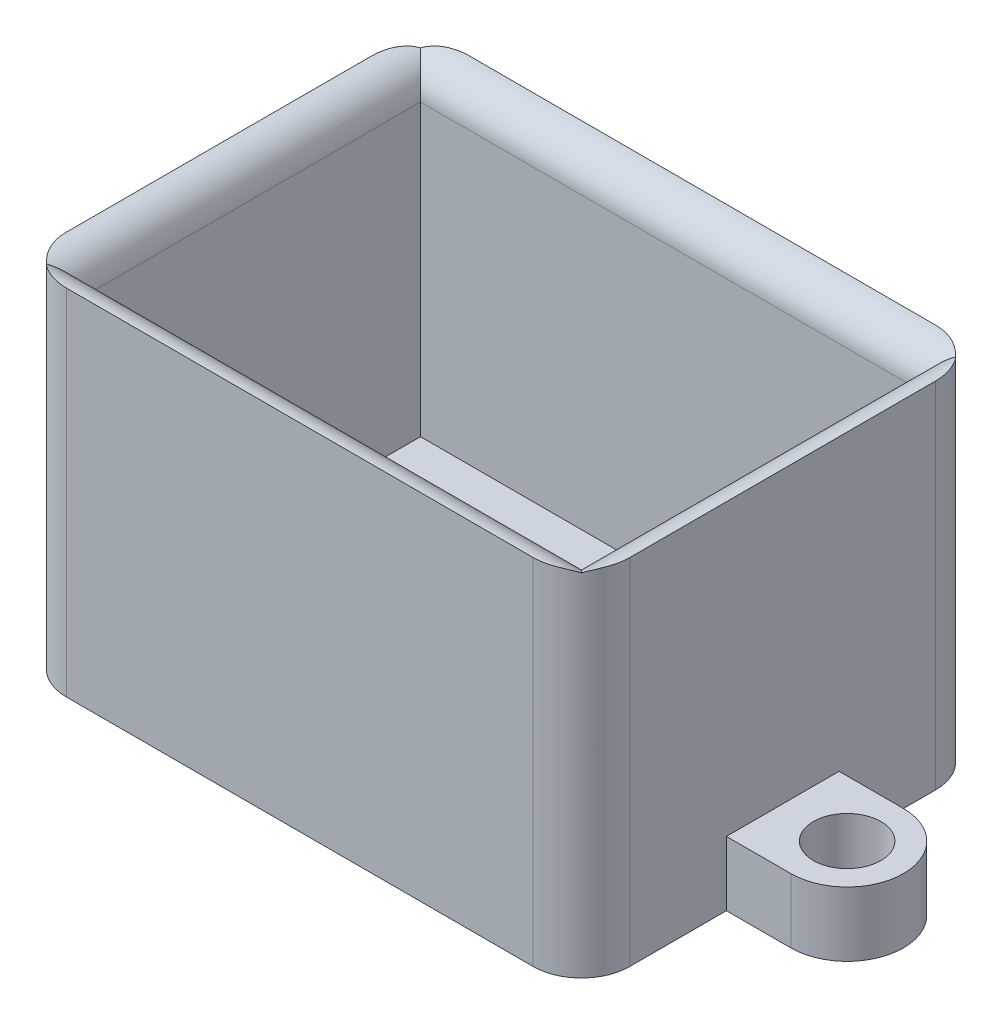
ISO-10303-21;
HEADER;
FILE_DESCRIPTION(('STEP AP214'),'2;1');
FILE_NAME('part.step','',(''),(''),'','','');
FILE_SCHEMA(('AUTOMOTIVE_DESIGN { 1 0 10303 214 1 1 1 1 }'));
ENDSEC;
DATA;
#1=APPLICATION_CONTEXT('core data for automotive mechanical design processes');
#2=APPLICATION_PROTOCOL_DEFINITION('international standard','automotive_design',2000,#1);
#3=PRODUCT_CONTEXT('',#1,'mechanical');
#4=PRODUCT('Part','Part','',(#3));
#5=PRODUCT_RELATED_PRODUCT_CATEGORY('part','',(#4));
#6=PRODUCT_DEFINITION_FORMATION('','',#4);
#7=PRODUCT_DEFINITION_CONTEXT('part definition',#1,'design');
#8=PRODUCT_DEFINITION('design','',#6,#7);
#9=PRODUCT_DEFINITION_SHAPE('','',#8);
#10=(LENGTH_UNIT() NAMED_UNIT(*) SI_UNIT(.MILLI.,.METRE.));
#11=(NAMED_UNIT(*) PLANE_ANGLE_UNIT() SI_UNIT($,.RADIAN.));
#12=(NAMED_UNIT(*) SI_UNIT($,.STERADIAN.) SOLID_ANGLE_UNIT());
#13=UNCERTAINTY_MEASURE_WITH_UNIT(LENGTH_MEASURE(1.E-05),#10,'distance_accuracy_value','');
#14=(GEOMETRIC_REPRESENTATION_CONTEXT(3) GLOBAL_UNCERTAINTY_ASSIGNED_CONTEXT((#13)) GLOBAL_UNIT_ASSIGNED_CONTEXT((#10,
#11,#12)) REPRESENTATION_CONTEXT('',''));
#15=CARTESIAN_POINT('',(0.,0.,0.));
#16=DIRECTION('',(0.,0.,1.));
#17=DIRECTION('',(1.,0.,0.));
#18=AXIS2_PLACEMENT_3D('',#15,#16,#17);
#19=CARTESIAN_POINT('',(17.5,20.,-12.5));
#20=DIRECTION('',(-1.,0.,0.));
#21=DIRECTION('',(0.,0.,1.));
#22=AXIS2_PLACEMENT_3D('',#19,#20,#21);
#23=PLANE('',#22);
#24=DIRECTION('',(0.,0.,1.));
#25=VECTOR('',#24,1.);
#26=CARTESIAN_POINT('',(17.5,-2.,12.5));
#27=LINE('',#26,#25);
#28=CARTESIAN_POINT('',(17.5,-2.,-9.5));
#29=VERTEX_POINT('',#28);
#30=CARTESIAN_POINT('',(17.5,-2.,-3.49999999999999));
#31=VERTEX_POINT('',#30);
#32=EDGE_CURVE('E272',#29,#31,#27,.T.);
#33=ORIENTED_EDGE('',*,*,#32,.F.);
#34=DIRECTION('',(0.,-1.,0.));
#35=VECTOR('',#34,1.);
#36=CARTESIAN_POINT('',(17.5,20.,-9.50000000000001));
#37=LINE('',#36,#35);
#38=CARTESIAN_POINT('',(17.5,20.,-9.50000000000001));
#39=VERTEX_POINT('',#38);
#40=EDGE_CURVE('E326',#29,#39,#37,.F.);
#41=ORIENTED_EDGE('',*,*,#40,.T.);
#42=DIRECTION('',(0.,0.,-1.));
#43=VECTOR('',#42,1.);
#44=CARTESIAN_POINT('',(17.5,20.,-12.5));
#45=LINE('',#44,#43);
#46=CARTESIAN_POINT('',(17.5,20.,9.5));
#47=VERTEX_POINT('',#46);
#48=EDGE_CURVE('E297',#47,#39,#45,.T.);
#49=ORIENTED_EDGE('',*,*,#48,.F.);
#50=DIRECTION('',(0.,-1.,0.));
#51=VECTOR('',#50,1.);
#52=CARTESIAN_POINT('',(17.5,20.,9.5));
#53=LINE('',#52,#51);
#54=CARTESIAN_POINT('',(17.5,-2.,9.5));
#55=VERTEX_POINT('',#54);
#56=EDGE_CURVE('E323',#47,#55,#53,.T.);
#57=ORIENTED_EDGE('',*,*,#56,.T.);
#58=CARTESIAN_POINT('',(17.5,-2.,3.5));
#59=VERTEX_POINT('',#58);
#60=EDGE_CURVE('E271',#59,#55,#27,.T.);
#61=ORIENTED_EDGE('',*,*,#60,.F.);
#62=DIRECTION('',(0.,-1.,0.));
#63=VECTOR('',#62,1.);
#64=CARTESIAN_POINT('',(17.5,2.,3.5));
#65=LINE('',#64,#63);
#66=CARTESIAN_POINT('',(17.5,2.,3.5));
#67=VERTEX_POINT('',#66);
#68=EDGE_CURVE('E196',#67,#59,#65,.T.);
#69=ORIENTED_EDGE('',*,*,#68,.F.);
#70=DIRECTION('',(0.,0.,-1.));
#71=VECTOR('',#70,1.);
#72=CARTESIAN_POINT('',(17.5,2.,3.5));
#73=LINE('',#72,#71);
#74=CARTESIAN_POINT('',(17.5,2.,-3.49999999999999));
#75=VERTEX_POINT('',#74);
#76=EDGE_CURVE('E206',#67,#75,#73,.T.);
#77=ORIENTED_EDGE('',*,*,#76,.T.);
#78=DIRECTION('',(0.,-1.,0.));
#79=VECTOR('',#78,1.);
#80=CARTESIAN_POINT('',(17.5,2.,-3.49999999999999));
#81=LINE('',#80,#79);
#82=EDGE_CURVE('E226',#75,#31,#81,.T.);
#83=ORIENTED_EDGE('',*,*,#82,.T.);
#84=EDGE_LOOP('',(#33,#41,#49,#57,#61,#69,#77,#83));
#85=FACE_BOUND('',#84,.T.);
#86=ADVANCED_FACE('F32',(#85),#23,.F.);
#87=CARTESIAN_POINT('',(-17.5,20.,-12.5));
#88=DIRECTION('',(1.,0.,0.));
#89=DIRECTION('',(0.,0.,-1.));
#90=AXIS2_PLACEMENT_3D('',#87,#88,#89);
#91=PLANE('',#90);
#92=DIRECTION('',(0.,0.,1.));
#93=VECTOR('',#92,1.);
#94=CARTESIAN_POINT('',(-17.5,20.,-12.5));
#95=LINE('',#94,#93);
#96=CARTESIAN_POINT('',(-17.5,20.,-9.50000000000001));
#97=VERTEX_POINT('',#96);
#98=CARTESIAN_POINT('',(-17.5,20.,9.5));
#99=VERTEX_POINT('',#98);
#100=EDGE_CURVE('E303',#97,#99,#95,.T.);
#101=ORIENTED_EDGE('',*,*,#100,.F.);
#102=DIRECTION('',(0.,-1.,0.));
#103=VECTOR('',#102,1.);
#104=CARTESIAN_POINT('',(-17.5,20.,-9.50000000000001));
#105=LINE('',#104,#103);
#106=CARTESIAN_POINT('',(-17.5,-2.,-9.5));
#107=VERTEX_POINT('',#106);
#108=EDGE_CURVE('E332',#97,#107,#105,.T.);
#109=ORIENTED_EDGE('',*,*,#108,.T.);
#110=DIRECTION('',(0.,0.,-1.));
#111=VECTOR('',#110,1.);
#112=CARTESIAN_POINT('',(-17.5,-2.,12.5));
#113=LINE('',#112,#111);
#114=CARTESIAN_POINT('',(-17.5,-2.,-3.5));
#115=VERTEX_POINT('',#114);
#116=EDGE_CURVE('E259',#115,#107,#113,.T.);
#117=ORIENTED_EDGE('',*,*,#116,.F.);
#118=DIRECTION('',(0.,-1.,0.));
#119=VECTOR('',#118,1.);
#120=CARTESIAN_POINT('',(-17.5,2.,-3.5));
#121=LINE('',#120,#119);
#122=CARTESIAN_POINT('',(-17.5,2.,-3.5));
#123=VERTEX_POINT('',#122);
#124=EDGE_CURVE('E263',#123,#115,#121,.T.);
#125=ORIENTED_EDGE('',*,*,#124,.F.);
#126=DIRECTION('',(0.,0.,1.));
#127=VECTOR('',#126,1.);
#128=CARTESIAN_POINT('',(-17.5,2.,3.49999999999999));
#129=LINE('',#128,#127);
#130=CARTESIAN_POINT('',(-17.5,2.,3.49999999999999));
#131=VERTEX_POINT('',#130);
#132=EDGE_CURVE('E243',#123,#131,#129,.T.);
#133=ORIENTED_EDGE('',*,*,#132,.T.);
#134=DIRECTION('',(0.,-1.,0.));
#135=VECTOR('',#134,1.);
#136=CARTESIAN_POINT('',(-17.5,2.,3.49999999999999));
#137=LINE('',#136,#135);
#138=CARTESIAN_POINT('',(-17.5,-2.,3.49999999999999));
#139=VERTEX_POINT('',#138);
#140=EDGE_CURVE('E260',#131,#139,#137,.T.);
#141=ORIENTED_EDGE('',*,*,#140,.T.);
#142=CARTESIAN_POINT('',(-17.5,-2.,9.5));
#143=VERTEX_POINT('',#142);
#144=EDGE_CURVE('E266',#143,#139,#113,.T.);
#145=ORIENTED_EDGE('',*,*,#144,.F.);
#146=DIRECTION('',(0.,-1.,0.));
#147=VECTOR('',#146,1.);
#148=CARTESIAN_POINT('',(-17.5,20.,9.5));
#149=LINE('',#148,#147);
#150=EDGE_CURVE('E329',#143,#99,#149,.F.);
#151=ORIENTED_EDGE('',*,*,#150,.T.);
#152=EDGE_LOOP('',(#101,#109,#117,#125,#133,#141,#145,#151));
#153=FACE_BOUND('',#152,.T.);
#154=ADVANCED_FACE('F500',(#153),#91,.F.);
#155=CARTESIAN_POINT('',(-17.5,20.,-12.5));
#156=DIRECTION('',(0.,0.,1.));
#157=DIRECTION('',(1.,0.,0.));
#158=AXIS2_PLACEMENT_3D('',#155,#156,#157);
#159=PLANE('',#158);
#160=DIRECTION('',(-1.,0.,0.));
#161=VECTOR('',#160,1.);
#162=CARTESIAN_POINT('',(-17.5,20.,-12.5));
#163=LINE('',#162,#161);
#164=CARTESIAN_POINT('',(14.5,20.,-12.5));
#165=VERTEX_POINT('',#164);
#166=CARTESIAN_POINT('',(-14.5,20.,-12.5));
#167=VERTEX_POINT('',#166);
#168=EDGE_CURVE('E300',#165,#167,#163,.T.);
#169=ORIENTED_EDGE('',*,*,#168,.F.);
#170=DIRECTION('',(0.,-1.,0.));
#171=VECTOR('',#170,1.);
#172=CARTESIAN_POINT('',(14.5,20.,-12.5));
#173=LINE('',#172,#171);
#174=CARTESIAN_POINT('',(14.5,-2.,-12.5));
#175=VERTEX_POINT('',#174);
#176=EDGE_CURVE('E312',#165,#175,#173,.T.);
#177=ORIENTED_EDGE('',*,*,#176,.T.);
#178=DIRECTION('',(1.,0.,0.));
#179=VECTOR('',#178,1.);
#180=CARTESIAN_POINT('',(-17.5,-2.,-12.5));
#181=LINE('',#180,#179);
#182=CARTESIAN_POINT('',(-14.5,-2.,-12.5));
#183=VERTEX_POINT('',#182);
#184=EDGE_CURVE('E268',#183,#175,#181,.T.);
#185=ORIENTED_EDGE('',*,*,#184,.F.);
#186=DIRECTION('',(0.,-1.,0.));
#187=VECTOR('',#186,1.);
#188=CARTESIAN_POINT('',(-14.5,20.,-12.5));
#189=LINE('',#188,#187);
#190=EDGE_CURVE('E309',#183,#167,#189,.F.);
#191=ORIENTED_EDGE('',*,*,#190,.T.);
#192=EDGE_LOOP('',(#169,#177,#185,#191));
#193=FACE_BOUND('',#192,.T.);
#194=ADVANCED_FACE('F430',(#193),#159,.F.);
#195=CARTESIAN_POINT('',(-17.5,20.,12.5));
#196=DIRECTION('',(0.,0.,-1.));
#197=DIRECTION('',(-1.,0.,0.));
#198=AXIS2_PLACEMENT_3D('',#195,#196,#197);
#199=PLANE('',#198);
#200=DIRECTION('',(-1.,0.,0.));
#201=VECTOR('',#200,1.);
#202=CARTESIAN_POINT('',(-17.5,-2.,12.5));
#203=LINE('',#202,#201);
#204=CARTESIAN_POINT('',(14.5,-2.,12.5));
#205=VERTEX_POINT('',#204);
#206=CARTESIAN_POINT('',(-14.5,-2.,12.5));
#207=VERTEX_POINT('',#206);
#208=EDGE_CURVE('E274',#205,#207,#203,.T.);
#209=ORIENTED_EDGE('',*,*,#208,.F.);
#210=DIRECTION('',(0.,-1.,0.));
#211=VECTOR('',#210,1.);
#212=CARTESIAN_POINT('',(14.5,20.,12.5));
#213=LINE('',#212,#211);
#214=CARTESIAN_POINT('',(14.5,20.,12.5));
#215=VERTEX_POINT('',#214);
#216=EDGE_CURVE('E338',#205,#215,#213,.F.);
#217=ORIENTED_EDGE('',*,*,#216,.T.);
#218=DIRECTION('',(1.,0.,0.));
#219=VECTOR('',#218,1.);
#220=CARTESIAN_POINT('',(-17.5,20.,12.5));
#221=LINE('',#220,#219);
#222=CARTESIAN_POINT('',(-14.5,20.,12.5));
#223=VERTEX_POINT('',#222);
#224=EDGE_CURVE('E306',#223,#215,#221,.T.);
#225=ORIENTED_EDGE('',*,*,#224,.F.);
#226=DIRECTION('',(0.,-1.,0.));
#227=VECTOR('',#226,1.);
#228=CARTESIAN_POINT('',(-14.5,20.,12.5));
#229=LINE('',#228,#227);
#230=EDGE_CURVE('E335',#223,#207,#229,.T.);
#231=ORIENTED_EDGE('',*,*,#230,.T.);
#232=EDGE_LOOP('',(#209,#217,#225,#231));
#233=FACE_BOUND('',#232,.T.);
#234=ADVANCED_FACE('F450',(#233),#199,.F.);
#235=CARTESIAN_POINT('',(15.5,20.,-10.5));
#236=DIRECTION('',(-1.,0.,0.));
#237=DIRECTION('',(0.,0.,1.));
#238=AXIS2_PLACEMENT_3D('',#235,#236,#237);
#239=PLANE('',#238);
#240=DIRECTION('',(0.,-1.,0.));
#241=VECTOR('',#240,1.);
#242=CARTESIAN_POINT('',(15.5,20.,10.5));
#243=LINE('',#242,#241);
#244=CARTESIAN_POINT('',(15.5,18.,10.5));
#245=VERTEX_POINT('',#244);
#246=CARTESIAN_POINT('',(15.5,0.,10.5));
#247=VERTEX_POINT('',#246);
#248=EDGE_CURVE('E289',#245,#247,#243,.T.);
#249=ORIENTED_EDGE('',*,*,#248,.F.);
#250=DIRECTION('',(0.,0.,-1.));
#251=VECTOR('',#250,1.);
#252=CARTESIAN_POINT('',(15.5,18.,-10.5));
#253=LINE('',#252,#251);
#254=CARTESIAN_POINT('',(15.5,18.,-10.5));
#255=VERTEX_POINT('',#254);
#256=EDGE_CURVE('E341',#245,#255,#253,.T.);
#257=ORIENTED_EDGE('',*,*,#256,.T.);
#258=DIRECTION('',(0.,-1.,0.));
#259=VECTOR('',#258,1.);
#260=CARTESIAN_POINT('',(15.5,20.,-10.5));
#261=LINE('',#260,#259);
#262=CARTESIAN_POINT('',(15.5,0.,-10.5));
#263=VERTEX_POINT('',#262);
#264=EDGE_CURVE('E295',#255,#263,#261,.T.);
#265=ORIENTED_EDGE('',*,*,#264,.T.);
#266=DIRECTION('',(0.,0.,-1.));
#267=VECTOR('',#266,1.);
#268=CARTESIAN_POINT('',(15.5,0.,-10.5));
#269=LINE('',#268,#267);
#270=EDGE_CURVE('E277',#247,#263,#269,.T.);
#271=ORIENTED_EDGE('',*,*,#270,.F.);
#272=EDGE_LOOP('',(#249,#257,#265,#271));
#273=FACE_BOUND('',#272,.T.);
#274=ADVANCED_FACE('F474',(#273),#239,.T.);
#275=CARTESIAN_POINT('',(-15.5,20.,-10.5));
#276=DIRECTION('',(0.,0.,1.));
#277=DIRECTION('',(1.,0.,0.));
#278=AXIS2_PLACEMENT_3D('',#275,#276,#277);
#279=PLANE('',#278);
#280=ORIENTED_EDGE('',*,*,#264,.F.);
#281=DIRECTION('',(-1.,0.,0.));
#282=VECTOR('',#281,1.);
#283=CARTESIAN_POINT('',(-15.5,18.,-10.5));
#284=LINE('',#283,#282);
#285=CARTESIAN_POINT('',(-15.5,18.,-10.5));
#286=VERTEX_POINT('',#285);
#287=EDGE_CURVE('E412',#255,#286,#284,.T.);
#288=ORIENTED_EDGE('',*,*,#287,.T.);
#289=DIRECTION('',(0.,-1.,0.));
#290=VECTOR('',#289,1.);
#291=CARTESIAN_POINT('',(-15.5,20.,-10.5));
#292=LINE('',#291,#290);
#293=CARTESIAN_POINT('',(-15.5,0.,-10.5));
#294=VERTEX_POINT('',#293);
#295=EDGE_CURVE('E293',#286,#294,#292,.T.);
#296=ORIENTED_EDGE('',*,*,#295,.T.);
#297=DIRECTION('',(-1.,0.,0.));
#298=VECTOR('',#297,1.);
#299=CARTESIAN_POINT('',(-15.5,0.,-10.5));
#300=LINE('',#299,#298);
#301=EDGE_CURVE('E280',#263,#294,#300,.T.);
#302=ORIENTED_EDGE('',*,*,#301,.F.);
#303=EDGE_LOOP('',(#280,#288,#296,#302));
#304=FACE_BOUND('',#303,.T.);
#305=ADVANCED_FACE('F477',(#304),#279,.T.);
#306=CARTESIAN_POINT('',(-15.5,20.,-10.5));
#307=DIRECTION('',(1.,0.,0.));
#308=DIRECTION('',(0.,0.,-1.));
#309=AXIS2_PLACEMENT_3D('',#306,#307,#308);
#310=PLANE('',#309);
#311=ORIENTED_EDGE('',*,*,#295,.F.);
#312=DIRECTION('',(0.,0.,1.));
#313=VECTOR('',#312,1.);
#314=CARTESIAN_POINT('',(-15.5,18.,-10.5));
#315=LINE('',#314,#313);
#316=CARTESIAN_POINT('',(-15.5,18.,10.5));
#317=VERTEX_POINT('',#316);
#318=EDGE_CURVE('E58',#286,#317,#315,.T.);
#319=ORIENTED_EDGE('',*,*,#318,.T.);
#320=DIRECTION('',(0.,-1.,0.));
#321=VECTOR('',#320,1.);
#322=CARTESIAN_POINT('',(-15.5,20.,10.5));
#323=LINE('',#322,#321);
#324=CARTESIAN_POINT('',(-15.5,0.,10.5));
#325=VERTEX_POINT('',#324);
#326=EDGE_CURVE('E291',#317,#325,#323,.T.);
#327=ORIENTED_EDGE('',*,*,#326,.T.);
#328=DIRECTION('',(0.,0.,1.));
#329=VECTOR('',#328,1.);
#330=CARTESIAN_POINT('',(-15.5,0.,-10.5));
#331=LINE('',#330,#329);
#332=EDGE_CURVE('E283',#294,#325,#331,.T.);
#333=ORIENTED_EDGE('',*,*,#332,.F.);
#334=EDGE_LOOP('',(#311,#319,#327,#333));
#335=FACE_BOUND('',#334,.T.);
#336=ADVANCED_FACE('F515',(#335),#310,.T.);
#337=CARTESIAN_POINT('',(-15.5,20.,10.5));
#338=DIRECTION('',(0.,0.,-1.));
#339=DIRECTION('',(-1.,0.,0.));
#340=AXIS2_PLACEMENT_3D('',#337,#338,#339);
#341=PLANE('',#340);
#342=ORIENTED_EDGE('',*,*,#326,.F.);
#343=DIRECTION('',(1.,0.,0.));
#344=VECTOR('',#343,1.);
#345=CARTESIAN_POINT('',(-15.5,18.,10.5));
#346=LINE('',#345,#344);
#347=EDGE_CURVE('E11',#317,#245,#346,.T.);
#348=ORIENTED_EDGE('',*,*,#347,.T.);
#349=ORIENTED_EDGE('',*,*,#248,.T.);
#350=DIRECTION('',(1.,0.,0.));
#351=VECTOR('',#350,1.);
#352=CARTESIAN_POINT('',(-15.5,0.,10.5));
#353=LINE('',#352,#351);
#354=EDGE_CURVE('E286',#325,#247,#353,.T.);
#355=ORIENTED_EDGE('',*,*,#354,.F.);
#356=EDGE_LOOP('',(#342,#348,#349,#355));
#357=FACE_BOUND('',#356,.T.);
#358=ADVANCED_FACE('F483',(#357),#341,.T.);
#359=CARTESIAN_POINT('',(0.,0.,0.));
#360=DIRECTION('',(0.,-1.,0.));
#361=DIRECTION('',(0.,0.,-1.));
#362=AXIS2_PLACEMENT_3D('',#359,#360,#361);
#363=PLANE('',#362);
#364=ORIENTED_EDGE('',*,*,#354,.T.);
#365=ORIENTED_EDGE('',*,*,#270,.T.);
#366=ORIENTED_EDGE('',*,*,#301,.T.);
#367=ORIENTED_EDGE('',*,*,#332,.T.);
#368=EDGE_LOOP('',(#364,#365,#366,#367));
#369=FACE_BOUND('',#368,.T.);
#370=ADVANCED_FACE('F480',(#369),#363,.F.);
#371=CARTESIAN_POINT('',(0.,-2.,0.));
#372=DIRECTION('',(0.,-1.,0.));
#373=DIRECTION('',(0.,0.,-1.));
#374=AXIS2_PLACEMENT_3D('',#371,#372,#373);
#375=PLANE('',#374);
#376=ORIENTED_EDGE('',*,*,#184,.T.);
#377=CARTESIAN_POINT('',(14.5,-2.,-9.50000000000001));
#378=DIRECTION('',(0.,-1.,0.));
#379=DIRECTION('',(0.,0.,-1.));
#380=AXIS2_PLACEMENT_3D('',#377,#378,#379);
#381=CIRCLE('',#380,3.);
#382=EDGE_CURVE('E321',#175,#29,#381,.T.);
#383=ORIENTED_EDGE('',*,*,#382,.T.);
#384=ORIENTED_EDGE('',*,*,#32,.T.);
#385=DIRECTION('',(1.,0.,0.));
#386=VECTOR('',#385,1.);
#387=CARTESIAN_POINT('',(21.5,-2.,-3.5));
#388=LINE('',#387,#386);
#389=CARTESIAN_POINT('',(21.5,-2.,-3.5));
#390=VERTEX_POINT('',#389);
#391=EDGE_CURVE('E210',#31,#390,#388,.T.);
#392=ORIENTED_EDGE('',*,*,#391,.T.);
#393=CARTESIAN_POINT('',(21.5,-2.,0.));
#394=DIRECTION('',(0.,-1.,0.));
#395=DIRECTION('',(0.,0.,1.));
#396=AXIS2_PLACEMENT_3D('',#393,#394,#395);
#397=CIRCLE('',#396,3.5);
#398=CARTESIAN_POINT('',(21.5,-2.,3.5));
#399=VERTEX_POINT('',#398);
#400=EDGE_CURVE('E220',#390,#399,#397,.T.);
#401=ORIENTED_EDGE('',*,*,#400,.T.);
#402=DIRECTION('',(-1.,0.,0.));
#403=VECTOR('',#402,1.);
#404=CARTESIAN_POINT('',(21.5,-2.,3.5));
#405=LINE('',#404,#403);
#406=EDGE_CURVE('E191',#399,#59,#405,.T.);
#407=ORIENTED_EDGE('',*,*,#406,.T.);
#408=ORIENTED_EDGE('',*,*,#60,.T.);
#409=CARTESIAN_POINT('',(14.5,-2.,9.5));
#410=DIRECTION('',(0.,-1.,0.));
#411=DIRECTION('',(0.,0.,-1.));
#412=AXIS2_PLACEMENT_3D('',#409,#410,#411);
#413=CIRCLE('',#412,3.);
#414=EDGE_CURVE('E317',#55,#205,#413,.T.);
#415=ORIENTED_EDGE('',*,*,#414,.T.);
#416=ORIENTED_EDGE('',*,*,#208,.T.);
#417=CARTESIAN_POINT('',(-14.5,-2.,9.5));
#418=DIRECTION('',(0.,-1.,0.));
#419=DIRECTION('',(0.,0.,-1.));
#420=AXIS2_PLACEMENT_3D('',#417,#418,#419);
#421=CIRCLE('',#420,3.);
#422=EDGE_CURVE('E315',#207,#143,#421,.T.);
#423=ORIENTED_EDGE('',*,*,#422,.T.);
#424=ORIENTED_EDGE('',*,*,#144,.T.);
#425=DIRECTION('',(-1.,0.,0.));
#426=VECTOR('',#425,1.);
#427=CARTESIAN_POINT('',(-21.5,-2.,3.5));
#428=LINE('',#427,#426);
#429=CARTESIAN_POINT('',(-21.5,-2.,3.5));
#430=VERTEX_POINT('',#429);
#431=EDGE_CURVE('E240',#139,#430,#428,.T.);
#432=ORIENTED_EDGE('',*,*,#431,.T.);
#433=CARTESIAN_POINT('',(-21.5,-2.,0.));
#434=DIRECTION('',(0.,-1.,0.));
#435=DIRECTION('',(0.,0.,-1.));
#436=AXIS2_PLACEMENT_3D('',#433,#434,#435);
#437=CIRCLE('',#436,3.5);
#438=CARTESIAN_POINT('',(-21.5,-2.,-3.5));
#439=VERTEX_POINT('',#438);
#440=EDGE_CURVE('E233',#430,#439,#437,.T.);
#441=ORIENTED_EDGE('',*,*,#440,.T.);
#442=DIRECTION('',(1.,0.,0.));
#443=VECTOR('',#442,1.);
#444=CARTESIAN_POINT('',(-21.5,-2.,-3.5));
#445=LINE('',#444,#443);
#446=EDGE_CURVE('E252',#439,#115,#445,.T.);
#447=ORIENTED_EDGE('',*,*,#446,.T.);
#448=ORIENTED_EDGE('',*,*,#116,.T.);
#449=CARTESIAN_POINT('',(-14.5,-2.,-9.50000000000001));
#450=DIRECTION('',(0.,-1.,0.));
#451=DIRECTION('',(0.,0.,-1.));
#452=AXIS2_PLACEMENT_3D('',#449,#450,#451);
#453=CIRCLE('',#452,3.);
#454=EDGE_CURVE('E319',#107,#183,#453,.T.);
#455=ORIENTED_EDGE('',*,*,#454,.T.);
#456=EDGE_LOOP('',(#376,#383,#384,#392,#401,#407,#408,#415,#416,#423,#424,#432,#441,#447,#448,#455));
#457=FACE_BOUND('',#456,.T.);
#458=CARTESIAN_POINT('',(-21.5,-2.,0.));
#459=DIRECTION('',(0.,-1.,0.));
#460=DIRECTION('',(0.,0.,-1.));
#461=AXIS2_PLACEMENT_3D('',#458,#459,#460);
#462=CIRCLE('',#461,2.1);
#463=CARTESIAN_POINT('',(-21.5,-2.,-2.1));
#464=VERTEX_POINT('',#463);
#465=EDGE_CURVE('E225',#464,#464,#462,.T.);
#466=ORIENTED_EDGE('',*,*,#465,.F.);
#467=EDGE_LOOP('',(#466));
#468=FACE_BOUND('',#467,.T.);
#469=CARTESIAN_POINT('',(21.5,-2.,0.));
#470=DIRECTION('',(0.,-1.,0.));
#471=DIRECTION('',(0.,0.,1.));
#472=AXIS2_PLACEMENT_3D('',#469,#470,#471);
#473=CIRCLE('',#472,2.1);
#474=CARTESIAN_POINT('',(21.5,-2.,2.1));
#475=VERTEX_POINT('',#474);
#476=EDGE_CURVE('E215',#475,#475,#473,.T.);
#477=ORIENTED_EDGE('',*,*,#476,.F.);
#478=EDGE_LOOP('',(#477));
#479=FACE_BOUND('',#478,.T.);
#480=ADVANCED_FACE('F436',(#457,#468,#479),#375,.T.);
#481=CARTESIAN_POINT('',(-21.5,2.,0.));
#482=DIRECTION('',(0.,-1.,0.));
#483=DIRECTION('',(0.,0.,-1.));
#484=AXIS2_PLACEMENT_3D('',#481,#482,#483);
#485=CYLINDRICAL_SURFACE('',#484,3.5);
#486=ORIENTED_EDGE('',*,*,#440,.F.);
#487=DIRECTION('',(0.,-1.,0.));
#488=VECTOR('',#487,1.);
#489=CARTESIAN_POINT('',(-21.5,2.,3.5));
#490=LINE('',#489,#488);
#491=CARTESIAN_POINT('',(-21.5,2.,3.5));
#492=VERTEX_POINT('',#491);
#493=EDGE_CURVE('E257',#492,#430,#490,.T.);
#494=ORIENTED_EDGE('',*,*,#493,.F.);
#495=CARTESIAN_POINT('',(-21.5,2.,0.));
#496=DIRECTION('',(0.,-1.,0.));
#497=DIRECTION('',(0.,0.,-1.));
#498=AXIS2_PLACEMENT_3D('',#495,#496,#497);
#499=CIRCLE('',#498,3.5);
#500=CARTESIAN_POINT('',(-21.5,2.,-3.5));
#501=VERTEX_POINT('',#500);
#502=EDGE_CURVE('E236',#492,#501,#499,.T.);
#503=ORIENTED_EDGE('',*,*,#502,.T.);
#504=DIRECTION('',(0.,-1.,0.));
#505=VECTOR('',#504,1.);
#506=CARTESIAN_POINT('',(-21.5,2.,-3.5));
#507=LINE('',#506,#505);
#508=EDGE_CURVE('E249',#501,#439,#507,.T.);
#509=ORIENTED_EDGE('',*,*,#508,.T.);
#510=EDGE_LOOP('',(#486,#494,#503,#509));
#511=FACE_BOUND('',#510,.T.);
#512=ADVANCED_FACE('F524',(#511),#485,.T.);
#513=CARTESIAN_POINT('',(-21.5,2.,3.5));
#514=DIRECTION('',(0.,0.,1.));
#515=DIRECTION('',(1.,0.,0.));
#516=AXIS2_PLACEMENT_3D('',#513,#514,#515);
#517=PLANE('',#516);
#518=ORIENTED_EDGE('',*,*,#431,.F.);
#519=ORIENTED_EDGE('',*,*,#140,.F.);
#520=DIRECTION('',(-1.,0.,0.));
#521=VECTOR('',#520,1.);
#522=CARTESIAN_POINT('',(-21.5,2.,3.5));
#523=LINE('',#522,#521);
#524=EDGE_CURVE('E246',#131,#492,#523,.T.);
#525=ORIENTED_EDGE('',*,*,#524,.T.);
#526=ORIENTED_EDGE('',*,*,#493,.T.);
#527=EDGE_LOOP('',(#518,#519,#525,#526));
#528=FACE_BOUND('',#527,.T.);
#529=ADVANCED_FACE('F527',(#528),#517,.T.);
#530=CARTESIAN_POINT('',(-21.5,2.,-3.5));
#531=DIRECTION('',(0.,0.,-1.));
#532=DIRECTION('',(-1.,0.,0.));
#533=AXIS2_PLACEMENT_3D('',#530,#531,#532);
#534=PLANE('',#533);
#535=ORIENTED_EDGE('',*,*,#446,.F.);
#536=ORIENTED_EDGE('',*,*,#508,.F.);
#537=DIRECTION('',(1.,0.,0.));
#538=VECTOR('',#537,1.);
#539=CARTESIAN_POINT('',(-21.5,2.,-3.5));
#540=LINE('',#539,#538);
#541=EDGE_CURVE('E239',#501,#123,#540,.T.);
#542=ORIENTED_EDGE('',*,*,#541,.T.);
#543=ORIENTED_EDGE('',*,*,#124,.T.);
#544=EDGE_LOOP('',(#535,#536,#542,#543));
#545=FACE_BOUND('',#544,.T.);
#546=ADVANCED_FACE('F529',(#545),#534,.T.);
#547=CARTESIAN_POINT('',(-21.5,2.,0.));
#548=DIRECTION('',(0.,-1.,0.));
#549=DIRECTION('',(0.,0.,-1.));
#550=AXIS2_PLACEMENT_3D('',#547,#548,#549);
#551=PLANE('',#550);
#552=CARTESIAN_POINT('',(-21.5,2.,0.));
#553=DIRECTION('',(0.,-1.,0.));
#554=DIRECTION('',(0.,0.,-1.));
#555=AXIS2_PLACEMENT_3D('',#552,#553,#554);
#556=CIRCLE('',#555,2.1);
#557=CARTESIAN_POINT('',(-21.5,2.,-2.1));
#558=VERTEX_POINT('',#557);
#559=EDGE_CURVE('E230',#558,#558,#556,.T.);
#560=ORIENTED_EDGE('',*,*,#559,.T.);
#561=EDGE_LOOP('',(#560));
#562=FACE_BOUND('',#561,.T.);
#563=ORIENTED_EDGE('',*,*,#502,.F.);
#564=ORIENTED_EDGE('',*,*,#524,.F.);
#565=ORIENTED_EDGE('',*,*,#132,.F.);
#566=ORIENTED_EDGE('',*,*,#541,.F.);
#567=EDGE_LOOP('',(#563,#564,#565,#566));
#568=FACE_BOUND('',#567,.T.);
#569=ADVANCED_FACE('F532',(#562,#568),#551,.F.);
#570=CARTESIAN_POINT('',(-21.5,2.,0.));
#571=DIRECTION('',(0.,-1.,0.));
#572=DIRECTION('',(0.,0.,-1.));
#573=AXIS2_PLACEMENT_3D('',#570,#571,#572);
#574=CYLINDRICAL_SURFACE('',#573,2.1);
#575=ORIENTED_EDGE('',*,*,#559,.F.);
#576=EDGE_LOOP('',(#575));
#577=FACE_BOUND('',#576,.T.);
#578=ORIENTED_EDGE('',*,*,#465,.T.);
#579=EDGE_LOOP('',(#578));
#580=FACE_BOUND('',#579,.T.);
#581=ADVANCED_FACE('F539',(#577,#580),#574,.F.);
#582=CARTESIAN_POINT('',(21.5,2.,0.));
#583=DIRECTION('',(0.,-1.,0.));
#584=DIRECTION('',(0.,0.,-1.));
#585=AXIS2_PLACEMENT_3D('',#582,#583,#584);
#586=CYLINDRICAL_SURFACE('',#585,3.5);
#587=ORIENTED_EDGE('',*,*,#400,.F.);
#588=DIRECTION('',(0.,-1.,0.));
#589=VECTOR('',#588,1.);
#590=CARTESIAN_POINT('',(21.5,2.,-3.5));
#591=LINE('',#590,#589);
#592=CARTESIAN_POINT('',(21.5,2.,-3.5));
#593=VERTEX_POINT('',#592);
#594=EDGE_CURVE('E209',#593,#390,#591,.T.);
#595=ORIENTED_EDGE('',*,*,#594,.F.);
#596=CARTESIAN_POINT('',(21.5,2.,0.));
#597=DIRECTION('',(0.,-1.,0.));
#598=DIRECTION('',(0.,0.,1.));
#599=AXIS2_PLACEMENT_3D('',#596,#597,#598);
#600=CIRCLE('',#599,3.5);
#601=CARTESIAN_POINT('',(21.5,2.,3.5));
#602=VERTEX_POINT('',#601);
#603=EDGE_CURVE('E203',#593,#602,#600,.T.);
#604=ORIENTED_EDGE('',*,*,#603,.T.);
#605=DIRECTION('',(0.,-1.,0.));
#606=VECTOR('',#605,1.);
#607=CARTESIAN_POINT('',(21.5,2.,3.5));
#608=LINE('',#607,#606);
#609=EDGE_CURVE('E185',#602,#399,#608,.T.);
#610=ORIENTED_EDGE('',*,*,#609,.T.);
#611=EDGE_LOOP('',(#587,#595,#604,#610));
#612=FACE_BOUND('',#611,.T.);
#613=ADVANCED_FACE('F208',(#612),#586,.T.);
#614=CARTESIAN_POINT('',(21.5,2.,-3.5));
#615=DIRECTION('',(0.,0.,-1.));
#616=DIRECTION('',(-1.,0.,0.));
#617=AXIS2_PLACEMENT_3D('',#614,#615,#616);
#618=PLANE('',#617);
#619=ORIENTED_EDGE('',*,*,#391,.F.);
#620=ORIENTED_EDGE('',*,*,#82,.F.);
#621=DIRECTION('',(1.,0.,0.));
#622=VECTOR('',#621,1.);
#623=CARTESIAN_POINT('',(21.5,2.,-3.5));
#624=LINE('',#623,#622);
#625=EDGE_CURVE('E197',#75,#593,#624,.T.);
#626=ORIENTED_EDGE('',*,*,#625,.T.);
#627=ORIENTED_EDGE('',*,*,#594,.T.);
#628=EDGE_LOOP('',(#619,#620,#626,#627));
#629=FACE_BOUND('',#628,.T.);
#630=ADVANCED_FACE('F442',(#629),#618,.T.);
#631=CARTESIAN_POINT('',(21.5,2.,3.5));
#632=DIRECTION('',(0.,0.,1.));
#633=DIRECTION('',(1.,0.,0.));
#634=AXIS2_PLACEMENT_3D('',#631,#632,#633);
#635=PLANE('',#634);
#636=ORIENTED_EDGE('',*,*,#406,.F.);
#637=ORIENTED_EDGE('',*,*,#609,.F.);
#638=DIRECTION('',(-1.,0.,0.));
#639=VECTOR('',#638,1.);
#640=CARTESIAN_POINT('',(21.5,2.,3.5));
#641=LINE('',#640,#639);
#642=EDGE_CURVE('E188',#602,#67,#641,.T.);
#643=ORIENTED_EDGE('',*,*,#642,.T.);
#644=ORIENTED_EDGE('',*,*,#68,.T.);
#645=EDGE_LOOP('',(#636,#637,#643,#644));
#646=FACE_BOUND('',#645,.T.);
#647=ADVANCED_FACE('F187',(#646),#635,.T.);
#648=CARTESIAN_POINT('',(21.5,2.,0.));
#649=DIRECTION('',(0.,1.,0.));
#650=DIRECTION('',(0.,0.,1.));
#651=AXIS2_PLACEMENT_3D('',#648,#649,#650);
#652=PLANE('',#651);
#653=CARTESIAN_POINT('',(21.5,2.,0.));
#654=DIRECTION('',(0.,-1.,0.));
#655=DIRECTION('',(0.,0.,1.));
#656=AXIS2_PLACEMENT_3D('',#653,#654,#655);
#657=CIRCLE('',#656,2.1);
#658=CARTESIAN_POINT('',(21.5,2.,2.1));
#659=VERTEX_POINT('',#658);
#660=EDGE_CURVE('E222',#659,#659,#657,.T.);
#661=ORIENTED_EDGE('',*,*,#660,.T.);
#662=EDGE_LOOP('',(#661));
#663=FACE_BOUND('',#662,.T.);
#664=ORIENTED_EDGE('',*,*,#603,.F.);
#665=ORIENTED_EDGE('',*,*,#625,.F.);
#666=ORIENTED_EDGE('',*,*,#76,.F.);
#667=ORIENTED_EDGE('',*,*,#642,.F.);
#668=EDGE_LOOP('',(#664,#665,#666,#667));
#669=FACE_BOUND('',#668,.T.);
#670=ADVANCED_FACE('F201',(#663,#669),#652,.T.);
#671=CARTESIAN_POINT('',(21.5,2.,0.));
#672=DIRECTION('',(0.,-1.,0.));
#673=DIRECTION('',(0.,0.,-1.));
#674=AXIS2_PLACEMENT_3D('',#671,#672,#673);
#675=CYLINDRICAL_SURFACE('',#674,2.1);
#676=ORIENTED_EDGE('',*,*,#660,.F.);
#677=EDGE_LOOP('',(#676));
#678=FACE_BOUND('',#677,.T.);
#679=ORIENTED_EDGE('',*,*,#476,.T.);
#680=EDGE_LOOP('',(#679));
#681=FACE_BOUND('',#680,.T.);
#682=ADVANCED_FACE('F491',(#678,#681),#675,.F.);
#683=CARTESIAN_POINT('',(14.5,20.,-9.50000000000001));
#684=DIRECTION('',(0.,-1.,0.));
#685=DIRECTION('',(0.,0.,-1.));
#686=AXIS2_PLACEMENT_3D('',#683,#684,#685);
#687=CYLINDRICAL_SURFACE('',#686,3.);
#688=CARTESIAN_POINT('',(14.5,20.,-12.5));
#689=CARTESIAN_POINT('',(14.5846065271603,19.9999593433504,-12.5000091469539));
#690=CARTESIAN_POINT('',(14.669211686239,19.999998730219,-12.4964212402013));
#691=CARTESIAN_POINT('',(14.8378272708385,19.9999436911634,-12.4821163311987));
#692=CARTESIAN_POINT('',(14.921837625234,19.9998492494992,-12.4713984904469));
#693=CARTESIAN_POINT('',(15.0893460433624,19.9992299567272,-12.4427800787386));
#694=CARTESIAN_POINT('',(15.172834013822,19.9987015276458,-12.4248204321395));
#695=CARTESIAN_POINT('',(15.3379596044148,19.9966240387787,-12.3818569864367));
#696=CARTESIAN_POINT('',(15.4195973802582,19.9950750652132,-12.3568537825063));
#697=CARTESIAN_POINT('',(15.5797412762635,19.9901992646866,-12.3002342875355));
#698=CARTESIAN_POINT('',(15.6582676321572,19.986887166075,-12.2686740834086));
#699=CARTESIAN_POINT('',(15.8122385413398,19.9775472244815,-12.1991041900448));
#700=CARTESIAN_POINT('',(15.8876836141928,19.9715198414286,-12.1610955937495));
#701=CARTESIAN_POINT('',(16.0343416594795,19.9556934836586,-12.0793021581003));
#702=CARTESIAN_POINT('',(16.1055784609714,19.9459186984783,-12.0355555254343));
#703=CARTESIAN_POINT('',(16.2435341552207,19.9213960997871,-11.9427418443036));
#704=CARTESIAN_POINT('',(16.3102572780533,19.9066530221551,-11.8936798926167));
#705=CARTESIAN_POINT('',(16.4180866052535,19.8766125360165,-11.8073975929452));
#706=CARTESIAN_POINT('',(16.4606053826147,19.8629741767701,-11.7713571636922));
#707=CARTESIAN_POINT('',(16.5430215095957,19.832387795602,-11.6975321611019));
#708=CARTESIAN_POINT('',(16.5829129404458,19.8154326211253,-11.6597439556834));
#709=CARTESIAN_POINT('',(16.6213203435596,19.7966418845607,-11.6213203435596));
#710=B_SPLINE_CURVE_WITH_KNOTS('',3,(#688,#689,#690,#691,#692,#693,#694,#695,#696,#697,#698,
#699,#700,#701,#702,#703,#704,#705,#706,#707,#708,#709),.UNSPECIFIED.,.F.,.F.,(4,2,2,2,2,2,2,2,
2,2,4),(0.,0.253741527701469,0.507512901449833,0.763397726949175,1.0192609369314,
1.27301957039842,1.52673523706033,1.77884001424009,2.03070515651123,2.20268303904215,
2.37503595534064),.UNSPECIFIED.);
#711=CARTESIAN_POINT('',(16.6213203435596,19.7966418845607,-11.6213203435596));
#712=VERTEX_POINT('',#711);
#713=EDGE_CURVE('E344',#165,#712,#710,.T.);
#714=ORIENTED_EDGE('',*,*,#713,.T.);
#715=CARTESIAN_POINT('',(16.6213203435596,19.7966418845607,-11.6213203435596));
#716=CARTESIAN_POINT('',(16.6669755820906,19.8189672912212,-11.5757001424394));
#717=CARTESIAN_POINT('',(16.711720856283,19.8386985701109,-11.5279756621899));
#718=CARTESIAN_POINT('',(16.7986794770629,19.873590862716,-11.4288272089484));
#719=CARTESIAN_POINT('',(16.8408964833002,19.8887586167744,-11.3774088324017));
#720=CARTESIAN_POINT('',(16.9219380386643,19.9151106823245,-11.2716194469008));
#721=CARTESIAN_POINT('',(16.9607844897939,19.9263224357358,-11.2172719194659));
#722=CARTESIAN_POINT('',(17.034995114884,19.9455687563171,-11.1057065855318));
#723=CARTESIAN_POINT('',(17.0703580711662,19.9536022154326,-11.0484877858359));
#724=CARTESIAN_POINT('',(17.1703367262689,19.9738162693157,-10.8737575116041));
#725=CARTESIAN_POINT('',(17.2293291359363,19.9822507870325,-10.7525380165038));
#726=CARTESIAN_POINT('',(17.3306465264238,19.9934728760948,-10.5028268854554));
#727=CARTESIAN_POINT('',(17.3729333945176,19.9962475942452,-10.3743193768263));
#728=CARTESIAN_POINT('',(17.4219206241098,19.9985324717739,-10.1828766958127));
#729=CARTESIAN_POINT('',(17.4355548340928,19.9989950183466,-10.1216526100423));
#730=CARTESIAN_POINT('',(17.4589632327745,19.9996139349789,-9.99846200893665));
#731=CARTESIAN_POINT('',(17.4687375930535,19.9997703186496,-9.93649552672907));
#732=CARTESIAN_POINT('',(17.4843632517214,19.9999547290137,-9.81223029497947));
#733=CARTESIAN_POINT('',(17.4902243240529,19.9999830765237,-9.74993276793698));
#734=CARTESIAN_POINT('',(17.4980439913021,19.9999997193887,-9.62509067616432));
#735=CARTESIAN_POINT('',(17.5000024228895,19.9999880130674,-9.56254610120466));
#736=CARTESIAN_POINT('',(17.5,20.,-9.50000000000001));
#737=B_SPLINE_CURVE_WITH_KNOTS('',3,(#715,#716,#717,#718,#719,#720,#721,#722,#723,#724,#725,
#726,#727,#728,#729,#730,#731,#732,#733,#734,#735,#736),.UNSPECIFIED.,.F.,.F.,(4,2,2,2,2,2,2,2,
2,2,4),(0.,0.204721577081598,0.409139278245764,0.612109731866484,0.815150885226563,
1.2188249892875,1.62341480620967,1.81149157380279,1.99955997994791,2.18715688603871,
2.3747616431289),.UNSPECIFIED.);
#738=EDGE_CURVE('E352',#712,#39,#737,.T.);
#739=ORIENTED_EDGE('',*,*,#738,.T.);
#740=ORIENTED_EDGE('',*,*,#40,.F.);
#741=ORIENTED_EDGE('',*,*,#382,.F.);
#742=ORIENTED_EDGE('',*,*,#176,.F.);
#743=EDGE_LOOP('',(#714,#739,#740,#741,#742));
#744=FACE_BOUND('',#743,.T.);
#745=ADVANCED_FACE('F359',(#744),#687,.T.);
#746=CARTESIAN_POINT('',(-14.5,20.,-9.50000000000001));
#747=DIRECTION('',(0.,-1.,0.));
#748=DIRECTION('',(0.,0.,-1.));
#749=AXIS2_PLACEMENT_3D('',#746,#747,#748);
#750=CYLINDRICAL_SURFACE('',#749,3.);
#751=CARTESIAN_POINT('',(-17.5,20.,-9.50000000000001));
#752=CARTESIAN_POINT('',(-17.5000091469539,19.9999593433504,-9.58460652716034));
#753=CARTESIAN_POINT('',(-17.4964212402013,19.999998730219,-9.669211686239));
#754=CARTESIAN_POINT('',(-17.4821163311987,19.9999436911634,-9.83782727083852));
#755=CARTESIAN_POINT('',(-17.4713984904469,19.9998492494992,-9.92183762523401));
#756=CARTESIAN_POINT('',(-17.4427800787386,19.9992299567272,-10.0893460433624));
#757=CARTESIAN_POINT('',(-17.4248204321395,19.9987015276458,-10.172834013822));
#758=CARTESIAN_POINT('',(-17.3818569864367,19.9966240387787,-10.3379596044148));
#759=CARTESIAN_POINT('',(-17.3568537825063,19.9950750652132,-10.4195973802582));
#760=CARTESIAN_POINT('',(-17.3002342875355,19.9901992646866,-10.5797412762635));
#761=CARTESIAN_POINT('',(-17.2686740834086,19.986887166075,-10.6582676321572));
#762=CARTESIAN_POINT('',(-17.1991041900448,19.9775472244815,-10.8122385413398));
#763=CARTESIAN_POINT('',(-17.1610955937495,19.9715198414286,-10.8876836141928));
#764=CARTESIAN_POINT('',(-17.0793021581003,19.9556934836586,-11.0343416594795));
#765=CARTESIAN_POINT('',(-17.0355555254343,19.9459186984783,-11.1055784609714));
#766=CARTESIAN_POINT('',(-16.9427418443036,19.9213960997871,-11.2435341552207));
#767=CARTESIAN_POINT('',(-16.8936798926167,19.9066530221551,-11.3102572780534));
#768=CARTESIAN_POINT('',(-16.8073975929452,19.8766125360165,-11.4180866052536));
#769=CARTESIAN_POINT('',(-16.7713571636922,19.8629741767701,-11.4606053826147));
#770=CARTESIAN_POINT('',(-16.6975321611019,19.832387795602,-11.5430215095957));
#771=CARTESIAN_POINT('',(-16.6597439556834,19.8154326211253,-11.5829129404458));
#772=CARTESIAN_POINT('',(-16.6213203435596,19.7966418845607,-11.6213203435596));
#773=B_SPLINE_CURVE_WITH_KNOTS('',3,(#751,#752,#753,#754,#755,#756,#757,#758,#759,#760,#761,
#762,#763,#764,#765,#766,#767,#768,#769,#770,#771,#772),.UNSPECIFIED.,.F.,.F.,(4,2,2,2,2,2,2,2,
2,2,4),(0.,0.253741527701469,0.507512901449831,0.763397726949175,1.0192609369314,
1.27301957039842,1.52673523706032,1.77884001424009,2.03070515651123,2.20268303904215,
2.37503595534064),.UNSPECIFIED.);
#774=CARTESIAN_POINT('',(-16.6213203435596,19.7966418845607,-11.6213203435596));
#775=VERTEX_POINT('',#774);
#776=EDGE_CURVE('E381',#97,#775,#773,.T.);
#777=ORIENTED_EDGE('',*,*,#776,.T.);
#778=CARTESIAN_POINT('',(-16.6213203435596,19.7966418845607,-11.6213203435596));
#779=CARTESIAN_POINT('',(-16.5757001424394,19.8189672912212,-11.6669755820906));
#780=CARTESIAN_POINT('',(-16.5279756621899,19.8386985701109,-11.711720856283));
#781=CARTESIAN_POINT('',(-16.4288272089484,19.873590862716,-11.7986794770629));
#782=CARTESIAN_POINT('',(-16.3774088324017,19.8887586167744,-11.8408964833002));
#783=CARTESIAN_POINT('',(-16.2716194469008,19.9151106823245,-11.9219380386643));
#784=CARTESIAN_POINT('',(-16.2172719194659,19.9263224357358,-11.9607844897939));
#785=CARTESIAN_POINT('',(-16.1057065855318,19.9455687563171,-12.034995114884));
#786=CARTESIAN_POINT('',(-16.0484877858359,19.9536022154326,-12.0703580711662));
#787=CARTESIAN_POINT('',(-15.8737575116041,19.9738162693157,-12.1703367262689));
#788=CARTESIAN_POINT('',(-15.7525380165038,19.9822507870325,-12.2293291359363));
#789=CARTESIAN_POINT('',(-15.5028268854554,19.9934728760948,-12.3306465264238));
#790=CARTESIAN_POINT('',(-15.3743193768263,19.9962475942452,-12.3729333945176));
#791=CARTESIAN_POINT('',(-15.1828766958127,19.9985324717739,-12.4219206241098));
#792=CARTESIAN_POINT('',(-15.1216526100423,19.9989950183466,-12.4355548340928));
#793=CARTESIAN_POINT('',(-14.9984620089366,19.9996139349789,-12.4589632327745));
#794=CARTESIAN_POINT('',(-14.9364955267291,19.9997703186496,-12.4687375930535));
#795=CARTESIAN_POINT('',(-14.8122302949795,19.9999547290137,-12.4843632517215));
#796=CARTESIAN_POINT('',(-14.749932767937,19.9999830765237,-12.4902243240529));
#797=CARTESIAN_POINT('',(-14.6250906761643,19.9999997193887,-12.4980439913021));
#798=CARTESIAN_POINT('',(-14.5625461012047,19.9999880130674,-12.5000024228895));
#799=CARTESIAN_POINT('',(-14.5,20.,-12.5));
#800=B_SPLINE_CURVE_WITH_KNOTS('',3,(#778,#779,#780,#781,#782,#783,#784,#785,#786,#787,#788,
#789,#790,#791,#792,#793,#794,#795,#796,#797,#798,#799),.UNSPECIFIED.,.F.,.F.,(4,2,2,2,2,2,2,2,
2,2,4),(0.,0.204721577081596,0.409139278245763,0.612109731866486,0.815150885226564,
1.2188249892875,1.62341480620967,1.8114915738028,1.99955997994791,2.18715688603871,
2.37476164312891),.UNSPECIFIED.);
#801=EDGE_CURVE('E374',#775,#167,#800,.T.);
#802=ORIENTED_EDGE('',*,*,#801,.T.);
#803=ORIENTED_EDGE('',*,*,#190,.F.);
#804=ORIENTED_EDGE('',*,*,#454,.F.);
#805=ORIENTED_EDGE('',*,*,#108,.F.);
#806=EDGE_LOOP('',(#777,#802,#803,#804,#805));
#807=FACE_BOUND('',#806,.T.);
#808=ADVANCED_FACE('F388',(#807),#750,.T.);
#809=CARTESIAN_POINT('',(14.5,20.,9.5));
#810=DIRECTION('',(0.,-1.,0.));
#811=DIRECTION('',(0.,0.,-1.));
#812=AXIS2_PLACEMENT_3D('',#809,#810,#811);
#813=CYLINDRICAL_SURFACE('',#812,3.);
#814=ORIENTED_EDGE('',*,*,#56,.F.);
#815=CARTESIAN_POINT('',(17.5,20.,9.5));
#816=CARTESIAN_POINT('',(17.5000091469539,19.9999593433504,9.58460652716034));
#817=CARTESIAN_POINT('',(17.4964212402013,19.999998730219,9.669211686239));
#818=CARTESIAN_POINT('',(17.4821163311987,19.9999436911634,9.83782727083852));
#819=CARTESIAN_POINT('',(17.4713984904469,19.9998492494992,9.92183762523401));
#820=CARTESIAN_POINT('',(17.4427800787386,19.9992299567272,10.0893460433624));
#821=CARTESIAN_POINT('',(17.4248204321395,19.9987015276458,10.172834013822));
#822=CARTESIAN_POINT('',(17.3818569864367,19.9966240387787,10.3379596044148));
#823=CARTESIAN_POINT('',(17.3568537825063,19.9950750652132,10.4195973802582));
#824=CARTESIAN_POINT('',(17.3002342875355,19.9901992646866,10.5797412762635));
#825=CARTESIAN_POINT('',(17.2686740834086,19.986887166075,10.6582676321572));
#826=CARTESIAN_POINT('',(17.1991041900448,19.9775472244815,10.8122385413398));
#827=CARTESIAN_POINT('',(17.1610955937495,19.9715198414286,10.8876836141928));
#828=CARTESIAN_POINT('',(17.0793021581003,19.9556934836586,11.0343416594795));
#829=CARTESIAN_POINT('',(17.0355555254343,19.9459186984783,11.1055784609714));
#830=CARTESIAN_POINT('',(16.9427418443036,19.9213960997871,11.2435341552207));
#831=CARTESIAN_POINT('',(16.8936798926167,19.9066530221551,11.3102572780533));
#832=CARTESIAN_POINT('',(16.8073975929451,19.8766125360165,11.4180866052535));
#833=CARTESIAN_POINT('',(16.7713571636922,19.8629741767701,11.4606053826147));
#834=CARTESIAN_POINT('',(16.6975321611019,19.832387795602,11.5430215095957));
#835=CARTESIAN_POINT('',(16.6597439556834,19.8154326211253,11.5829129404458));
#836=CARTESIAN_POINT('',(16.6213203435596,19.7966418845607,11.6213203435596));
#837=B_SPLINE_CURVE_WITH_KNOTS('',3,(#815,#816,#817,#818,#819,#820,#821,#822,#823,#824,#825,
#826,#827,#828,#829,#830,#831,#832,#833,#834,#835,#836),.UNSPECIFIED.,.F.,.F.,(4,2,2,2,2,2,2,2,
2,2,4),(0.,0.253741527701469,0.507512901449833,0.763397726949175,1.0192609369314,
1.27301957039842,1.52673523706032,1.77884001424009,2.03070515651123,2.20268303904215,
2.37503595534064),.UNSPECIFIED.);
#838=CARTESIAN_POINT('',(16.6213203435596,19.7966418845607,11.6213203435596));
#839=VERTEX_POINT('',#838);
#840=EDGE_CURVE('E407',#47,#839,#837,.T.);
#841=ORIENTED_EDGE('',*,*,#840,.T.);
#842=CARTESIAN_POINT('',(16.6213203435596,19.7966418845607,11.6213203435596));
#843=CARTESIAN_POINT('',(16.5757001424394,19.8189672912212,11.6669755820906));
#844=CARTESIAN_POINT('',(16.5279756621899,19.8386985701109,11.711720856283));
#845=CARTESIAN_POINT('',(16.4288272089484,19.873590862716,11.7986794770629));
#846=CARTESIAN_POINT('',(16.3774088324017,19.8887586167744,11.8408964833002));
#847=CARTESIAN_POINT('',(16.2716194469008,19.9151106823245,11.9219380386643));
#848=CARTESIAN_POINT('',(16.2172719194659,19.9263224357358,11.9607844897939));
#849=CARTESIAN_POINT('',(16.1057065855318,19.9455687563171,12.034995114884));
#850=CARTESIAN_POINT('',(16.0484877858359,19.9536022154326,12.0703580711662));
#851=CARTESIAN_POINT('',(15.8737575116041,19.9738162693157,12.1703367262689));
#852=CARTESIAN_POINT('',(15.7525380165038,19.9822507870325,12.2293291359363));
#853=CARTESIAN_POINT('',(15.5028268854554,19.9934728760948,12.3306465264238));
#854=CARTESIAN_POINT('',(15.3743193768263,19.9962475942452,12.3729333945176));
#855=CARTESIAN_POINT('',(15.1828766958127,19.9985324717739,12.4219206241098));
#856=CARTESIAN_POINT('',(15.1216526100423,19.9989950183466,12.4355548340928));
#857=CARTESIAN_POINT('',(14.9984620089366,19.9996139349789,12.4589632327745));
#858=CARTESIAN_POINT('',(14.9364955267291,19.9997703186496,12.4687375930535));
#859=CARTESIAN_POINT('',(14.8122302949795,19.9999547290137,12.4843632517214));
#860=CARTESIAN_POINT('',(14.749932767937,19.9999830765237,12.4902243240529));
#861=CARTESIAN_POINT('',(14.6250906761643,19.9999997193887,12.4980439913021));
#862=CARTESIAN_POINT('',(14.5625461012047,19.9999880130674,12.5000024228895));
#863=CARTESIAN_POINT('',(14.5,20.,12.5));
#864=B_SPLINE_CURVE_WITH_KNOTS('',3,(#842,#843,#844,#845,#846,#847,#848,#849,#850,#851,#852,
#853,#854,#855,#856,#857,#858,#859,#860,#861,#862,#863),.UNSPECIFIED.,.F.,.F.,(4,2,2,2,2,2,2,2,
2,2,4),(0.,0.204721577081598,0.409139278245765,0.612109731866485,0.815150885226563,
1.21882498928749,1.62341480620967,1.81149157380279,1.99955997994791,2.18715688603871,
2.37476164312891),.UNSPECIFIED.);
#865=EDGE_CURVE('E401',#839,#215,#864,.T.);
#866=ORIENTED_EDGE('',*,*,#865,.T.);
#867=ORIENTED_EDGE('',*,*,#216,.F.);
#868=ORIENTED_EDGE('',*,*,#414,.F.);
#869=EDGE_LOOP('',(#814,#841,#866,#867,#868));
#870=FACE_BOUND('',#869,.T.);
#871=ADVANCED_FACE('F392',(#870),#813,.T.);
#872=CARTESIAN_POINT('',(-14.5,20.,9.5));
#873=DIRECTION('',(0.,-1.,0.));
#874=DIRECTION('',(0.,0.,-1.));
#875=AXIS2_PLACEMENT_3D('',#872,#873,#874);
#876=CYLINDRICAL_SURFACE('',#875,3.);
#877=CARTESIAN_POINT('',(-14.5,20.,12.5));
#878=CARTESIAN_POINT('',(-14.5846065271603,19.9999593433504,12.5000091469539));
#879=CARTESIAN_POINT('',(-14.669211686239,19.999998730219,12.4964212402013));
#880=CARTESIAN_POINT('',(-14.8378272708385,19.9999436911634,12.4821163311987));
#881=CARTESIAN_POINT('',(-14.921837625234,19.9998492494992,12.4713984904469));
#882=CARTESIAN_POINT('',(-15.0893460433624,19.9992299567272,12.4427800787386));
#883=CARTESIAN_POINT('',(-15.172834013822,19.9987015276458,12.4248204321395));
#884=CARTESIAN_POINT('',(-15.3379596044148,19.9966240387787,12.3818569864367));
#885=CARTESIAN_POINT('',(-15.4195973802582,19.9950750652132,12.3568537825063));
#886=CARTESIAN_POINT('',(-15.5797412762635,19.9901992646866,12.3002342875355));
#887=CARTESIAN_POINT('',(-15.6582676321572,19.986887166075,12.2686740834086));
#888=CARTESIAN_POINT('',(-15.8122385413398,19.9775472244815,12.1991041900448));
#889=CARTESIAN_POINT('',(-15.8876836141928,19.9715198414286,12.1610955937495));
#890=CARTESIAN_POINT('',(-16.0343416594795,19.9556934836586,12.0793021581003));
#891=CARTESIAN_POINT('',(-16.1055784609714,19.9459186984783,12.0355555254343));
#892=CARTESIAN_POINT('',(-16.2435341552207,19.9213960997871,11.9427418443036));
#893=CARTESIAN_POINT('',(-16.3102572780533,19.9066530221551,11.8936798926167));
#894=CARTESIAN_POINT('',(-16.4180866052535,19.8766125360165,11.8073975929451));
#895=CARTESIAN_POINT('',(-16.4606053826147,19.8629741767701,11.7713571636922));
#896=CARTESIAN_POINT('',(-16.5430215095957,19.832387795602,11.6975321611019));
#897=CARTESIAN_POINT('',(-16.5829129404458,19.8154326211253,11.6597439556834));
#898=CARTESIAN_POINT('',(-16.6213203435596,19.7966418845607,11.6213203435596));
#899=B_SPLINE_CURVE_WITH_KNOTS('',3,(#877,#878,#879,#880,#881,#882,#883,#884,#885,#886,#887,
#888,#889,#890,#891,#892,#893,#894,#895,#896,#897,#898),.UNSPECIFIED.,.F.,.F.,(4,2,2,2,2,2,2,2,
2,2,4),(0.,0.253741527701471,0.507512901449833,0.763397726949175,1.0192609369314,
1.27301957039842,1.52673523706032,1.77884001424009,2.03070515651123,2.20268303904215,
2.37503595534064),.UNSPECIFIED.);
#900=CARTESIAN_POINT('',(-16.6213203435596,19.7966418845607,11.6213203435596));
#901=VERTEX_POINT('',#900);
#902=EDGE_CURVE('E50',#223,#901,#899,.T.);
#903=ORIENTED_EDGE('',*,*,#902,.T.);
#904=CARTESIAN_POINT('',(-16.6213203435596,19.7966418845607,11.6213203435596));
#905=CARTESIAN_POINT('',(-16.6669755820906,19.8189672912212,11.5757001424394));
#906=CARTESIAN_POINT('',(-16.711720856283,19.8386985701109,11.5279756621899));
#907=CARTESIAN_POINT('',(-16.7986794770629,19.873590862716,11.4288272089484));
#908=CARTESIAN_POINT('',(-16.8408964833002,19.8887586167744,11.3774088324017));
#909=CARTESIAN_POINT('',(-16.9219380386643,19.9151106823245,11.2716194469008));
#910=CARTESIAN_POINT('',(-16.9607844897939,19.9263224357358,11.2172719194659));
#911=CARTESIAN_POINT('',(-17.034995114884,19.9455687563171,11.1057065855318));
#912=CARTESIAN_POINT('',(-17.0703580711662,19.9536022154326,11.0484877858359));
#913=CARTESIAN_POINT('',(-17.1703367262689,19.9738162693157,10.8737575116041));
#914=CARTESIAN_POINT('',(-17.2293291359363,19.9822507870325,10.7525380165038));
#915=CARTESIAN_POINT('',(-17.3306465264238,19.9934728760948,10.5028268854554));
#916=CARTESIAN_POINT('',(-17.3729333945176,19.9962475942452,10.3743193768263));
#917=CARTESIAN_POINT('',(-17.4219206241098,19.9985324717739,10.1828766958127));
#918=CARTESIAN_POINT('',(-17.4355548340928,19.9989950183466,10.1216526100423));
#919=CARTESIAN_POINT('',(-17.4589632327745,19.9996139349789,9.99846200893664));
#920=CARTESIAN_POINT('',(-17.4687375930535,19.9997703186496,9.93649552672906));
#921=CARTESIAN_POINT('',(-17.4843632517214,19.9999547290137,9.81223029497947));
#922=CARTESIAN_POINT('',(-17.4902243240529,19.9999830765237,9.74993276793697));
#923=CARTESIAN_POINT('',(-17.4980439913021,19.9999997193887,9.62509067616432));
#924=CARTESIAN_POINT('',(-17.5000024228895,19.9999880130674,9.56254610120466));
#925=CARTESIAN_POINT('',(-17.5,20.,9.5));
#926=B_SPLINE_CURVE_WITH_KNOTS('',3,(#904,#905,#906,#907,#908,#909,#910,#911,#912,#913,#914,
#915,#916,#917,#918,#919,#920,#921,#922,#923,#924,#925),.UNSPECIFIED.,.F.,.F.,(4,2,2,2,2,2,2,2,
2,2,4),(0.,0.2047215770816,0.409139278245765,0.612109731866484,0.815150885226563,
1.2188249892875,1.62341480620967,1.81149157380279,1.99955997994791,2.18715688603871,
2.3747616431289),.UNSPECIFIED.);
#927=EDGE_CURVE('E42',#901,#99,#926,.T.);
#928=ORIENTED_EDGE('',*,*,#927,.T.);
#929=ORIENTED_EDGE('',*,*,#150,.F.);
#930=ORIENTED_EDGE('',*,*,#422,.F.);
#931=ORIENTED_EDGE('',*,*,#230,.F.);
#932=EDGE_LOOP('',(#903,#928,#929,#930,#931));
#933=FACE_BOUND('',#932,.T.);
#934=ADVANCED_FACE('F397',(#933),#876,.T.);
#935=CARTESIAN_POINT('',(-17.5,18.,-10.5));
#936=DIRECTION('',(0.,0.,1.));
#937=DIRECTION('',(1.,0.,0.));
#938=AXIS2_PLACEMENT_3D('',#935,#936,#937);
#939=CYLINDRICAL_SURFACE('',#938,2.);
#940=ORIENTED_EDGE('',*,*,#100,.T.);
#941=ORIENTED_EDGE('',*,*,#927,.F.);
#942=CARTESIAN_POINT('',(-17.5,18.,12.5));
#943=DIRECTION('',(0.707106781186547,0.,0.707106781186547));
#944=DIRECTION('',(0.707106781186547,0.,-0.707106781186548));
#945=AXIS2_PLACEMENT_3D('',#942,#943,#944);
#946=ELLIPSE('',#945,2.82842712474619,2.);
#947=EDGE_CURVE('E37',#317,#901,#946,.T.);
#948=ORIENTED_EDGE('',*,*,#947,.F.);
#949=ORIENTED_EDGE('',*,*,#318,.F.);
#950=CARTESIAN_POINT('',(-17.5,18.,-12.5));
#951=DIRECTION('',(-0.707106781186547,0.,0.707106781186548));
#952=DIRECTION('',(0.707106781186547,0.,0.707106781186547));
#953=AXIS2_PLACEMENT_3D('',#950,#951,#952);
#954=ELLIPSE('',#953,2.82842712474619,2.);
#955=EDGE_CURVE('E423',#775,#286,#954,.F.);
#956=ORIENTED_EDGE('',*,*,#955,.F.);
#957=ORIENTED_EDGE('',*,*,#776,.F.);
#958=EDGE_LOOP('',(#940,#941,#948,#949,#956,#957));
#959=FACE_BOUND('',#958,.T.);
#960=ADVANCED_FACE('F34',(#959),#939,.T.);
#961=CARTESIAN_POINT('',(-15.5,18.,12.5));
#962=DIRECTION('',(1.,0.,0.));
#963=DIRECTION('',(0.,0.,-1.));
#964=AXIS2_PLACEMENT_3D('',#961,#962,#963);
#965=CYLINDRICAL_SURFACE('',#964,2.);
#966=ORIENTED_EDGE('',*,*,#224,.T.);
#967=ORIENTED_EDGE('',*,*,#865,.F.);
#968=CARTESIAN_POINT('',(17.5,18.,12.5));
#969=DIRECTION('',(0.707106781186547,0.,-0.707106781186548));
#970=DIRECTION('',(0.707106781186548,0.,0.707106781186547));
#971=AXIS2_PLACEMENT_3D('',#968,#969,#970);
#972=ELLIPSE('',#971,2.82842712474619,2.);
#973=EDGE_CURVE('E425',#245,#839,#972,.T.);
#974=ORIENTED_EDGE('',*,*,#973,.F.);
#975=ORIENTED_EDGE('',*,*,#347,.F.);
#976=ORIENTED_EDGE('',*,*,#947,.T.);
#977=ORIENTED_EDGE('',*,*,#902,.F.);
#978=EDGE_LOOP('',(#966,#967,#974,#975,#976,#977));
#979=FACE_BOUND('',#978,.T.);
#980=ADVANCED_FACE('F367',(#979),#965,.T.);
#981=CARTESIAN_POINT('',(-15.5,18.,-12.5));
#982=DIRECTION('',(-1.,0.,0.));
#983=DIRECTION('',(0.,0.,1.));
#984=AXIS2_PLACEMENT_3D('',#981,#982,#983);
#985=CYLINDRICAL_SURFACE('',#984,2.);
#986=ORIENTED_EDGE('',*,*,#955,.T.);
#987=ORIENTED_EDGE('',*,*,#287,.F.);
#988=CARTESIAN_POINT('',(17.5,18.,-12.5));
#989=DIRECTION('',(-0.707106781186548,0.,-0.707106781186547));
#990=DIRECTION('',(-0.707106781186547,0.,0.707106781186548));
#991=AXIS2_PLACEMENT_3D('',#988,#989,#990);
#992=ELLIPSE('',#991,2.82842712474619,2.);
#993=EDGE_CURVE('E465',#712,#255,#992,.F.);
#994=ORIENTED_EDGE('',*,*,#993,.F.);
#995=ORIENTED_EDGE('',*,*,#713,.F.);
#996=ORIENTED_EDGE('',*,*,#168,.T.);
#997=ORIENTED_EDGE('',*,*,#801,.F.);
#998=EDGE_LOOP('',(#986,#987,#994,#995,#996,#997));
#999=FACE_BOUND('',#998,.T.);
#1000=ADVANCED_FACE('F363',(#999),#985,.T.);
#1001=CARTESIAN_POINT('',(17.5,18.,-10.5));
#1002=DIRECTION('',(0.,0.,-1.));
#1003=DIRECTION('',(-1.,0.,0.));
#1004=AXIS2_PLACEMENT_3D('',#1001,#1002,#1003);
#1005=CYLINDRICAL_SURFACE('',#1004,2.);
#1006=ORIENTED_EDGE('',*,*,#840,.F.);
#1007=ORIENTED_EDGE('',*,*,#48,.T.);
#1008=ORIENTED_EDGE('',*,*,#738,.F.);
#1009=ORIENTED_EDGE('',*,*,#993,.T.);
#1010=ORIENTED_EDGE('',*,*,#256,.F.);
#1011=ORIENTED_EDGE('',*,*,#973,.T.);
#1012=EDGE_LOOP('',(#1006,#1007,#1008,#1009,#1010,#1011));
#1013=FACE_BOUND('',#1012,.T.);
#1014=ADVANCED_FACE('F366',(#1013),#1005,.T.);
#1015=CLOSED_SHELL('',(#86,#154,#194,#234,#274,#305,#336,#358,#370,#480,#512,#529,#546,#569,
#581,#613,#630,#647,#670,#682,#745,#808,#871,#934,#960,#980,#1000,#1014));
#1016=MANIFOLD_SOLID_BREP('B2',#1015);
#1017=ADVANCED_BREP_SHAPE_REPRESENTATION('',(#18,#1016),#14);
#1018=SHAPE_DEFINITION_REPRESENTATION(#9,#1017);
ENDSEC;
END-ISO-10303-21;
